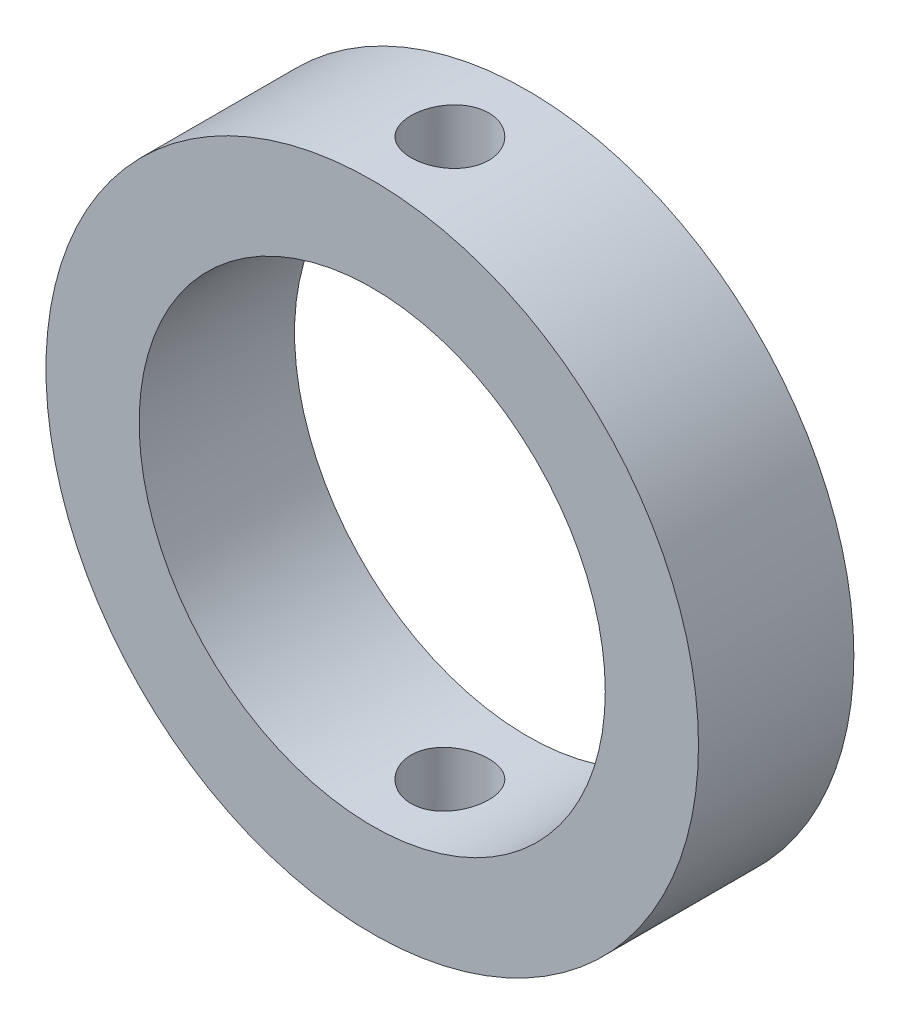
ISO-10303-21;
HEADER;
FILE_DESCRIPTION(('STEP AP214'),'2;1');
FILE_NAME('part.step','',(''),(''),'','','');
FILE_SCHEMA(('AUTOMOTIVE_DESIGN { 1 0 10303 214 1 1 1 1 }'));
ENDSEC;
DATA;
#1=APPLICATION_CONTEXT('core data for automotive mechanical design processes');
#2=APPLICATION_PROTOCOL_DEFINITION('international standard','automotive_design',2000,#1);
#3=PRODUCT_CONTEXT('',#1,'mechanical');
#4=PRODUCT('Part','Part','',(#3));
#5=PRODUCT_RELATED_PRODUCT_CATEGORY('part','',(#4));
#6=PRODUCT_DEFINITION_FORMATION('','',#4);
#7=PRODUCT_DEFINITION_CONTEXT('part definition',#1,'design');
#8=PRODUCT_DEFINITION('design','',#6,#7);
#9=PRODUCT_DEFINITION_SHAPE('','',#8);
#10=(LENGTH_UNIT() NAMED_UNIT(*) SI_UNIT(.MILLI.,.METRE.));
#11=(NAMED_UNIT(*) PLANE_ANGLE_UNIT() SI_UNIT($,.RADIAN.));
#12=(NAMED_UNIT(*) SI_UNIT($,.STERADIAN.) SOLID_ANGLE_UNIT());
#13=UNCERTAINTY_MEASURE_WITH_UNIT(LENGTH_MEASURE(1.E-05),#10,'distance_accuracy_value','');
#14=(GEOMETRIC_REPRESENTATION_CONTEXT(3) GLOBAL_UNCERTAINTY_ASSIGNED_CONTEXT((#13)) GLOBAL_UNIT_ASSIGNED_CONTEXT((#10,
#11,#12)) REPRESENTATION_CONTEXT('',''));
#15=CARTESIAN_POINT('',(0.,0.,0.));
#16=DIRECTION('',(0.,0.,1.));
#17=DIRECTION('',(1.,0.,0.));
#18=AXIS2_PLACEMENT_3D('',#15,#16,#17);
#19=CARTESIAN_POINT('',(0.,0.,20.));
#20=DIRECTION('',(0.,0.,1.));
#21=DIRECTION('',(1.,0.,0.));
#22=AXIS2_PLACEMENT_3D('',#19,#20,#21);
#23=PLANE('',#22);
#24=CARTESIAN_POINT('',(0.,0.,20.));
#25=DIRECTION('',(0.,0.,1.));
#26=DIRECTION('',(1.,0.,0.));
#27=AXIS2_PLACEMENT_3D('',#24,#25,#26);
#28=CIRCLE('',#27,42.);
#29=CARTESIAN_POINT('',(42.,0.,20.));
#30=VERTEX_POINT('',#29);
#31=EDGE_CURVE('E10',#30,#30,#28,.T.);
#32=ORIENTED_EDGE('',*,*,#31,.T.);
#33=EDGE_LOOP('',(#32));
#34=FACE_BOUND('',#33,.T.);
#35=CARTESIAN_POINT('',(0.,0.,20.));
#36=DIRECTION('',(0.,0.,1.));
#37=DIRECTION('',(1.,0.,0.));
#38=AXIS2_PLACEMENT_3D('',#35,#36,#37);
#39=CIRCLE('',#38,30.);
#40=CARTESIAN_POINT('',(30.,0.,20.));
#41=VERTEX_POINT('',#40);
#42=EDGE_CURVE('E53',#41,#41,#39,.T.);
#43=ORIENTED_EDGE('',*,*,#42,.F.);
#44=EDGE_LOOP('',(#43));
#45=FACE_BOUND('',#44,.T.);
#46=ADVANCED_FACE('F34',(#34,#45),#23,.T.);
#47=CARTESIAN_POINT('',(0.,0.,0.));
#48=DIRECTION('',(0.,0.,1.));
#49=DIRECTION('',(1.,0.,0.));
#50=AXIS2_PLACEMENT_3D('',#47,#48,#49);
#51=PLANE('',#50);
#52=CARTESIAN_POINT('',(0.,0.,0.));
#53=DIRECTION('',(0.,0.,1.));
#54=DIRECTION('',(1.,0.,0.));
#55=AXIS2_PLACEMENT_3D('',#52,#53,#54);
#56=CIRCLE('',#55,42.);
#57=CARTESIAN_POINT('',(42.,0.,0.));
#58=VERTEX_POINT('',#57);
#59=EDGE_CURVE('E48',#58,#58,#56,.T.);
#60=ORIENTED_EDGE('',*,*,#59,.F.);
#61=EDGE_LOOP('',(#60));
#62=FACE_BOUND('',#61,.T.);
#63=CARTESIAN_POINT('',(0.,0.,0.));
#64=DIRECTION('',(0.,0.,1.));
#65=DIRECTION('',(1.,0.,0.));
#66=AXIS2_PLACEMENT_3D('',#63,#64,#65);
#67=CIRCLE('',#66,30.);
#68=CARTESIAN_POINT('',(30.,0.,0.));
#69=VERTEX_POINT('',#68);
#70=EDGE_CURVE('E56',#69,#69,#67,.T.);
#71=ORIENTED_EDGE('',*,*,#70,.T.);
#72=EDGE_LOOP('',(#71));
#73=FACE_BOUND('',#72,.T.);
#74=ADVANCED_FACE('F92',(#62,#73),#51,.F.);
#75=CARTESIAN_POINT('',(0.,0.,20.));
#76=DIRECTION('',(0.,0.,-1.));
#77=DIRECTION('',(-1.,0.,0.));
#78=AXIS2_PLACEMENT_3D('',#75,#76,#77);
#79=CYLINDRICAL_SURFACE('',#78,42.);
#80=CARTESIAN_POINT('',(0.,-42.,15.));
#81=CARTESIAN_POINT('',(0.139944354363099,-42.0000004949897,15.0000015452399));
#82=CARTESIAN_POINT('',(0.279865797325127,-41.9992991699703,14.9941225446518));
#83=CARTESIAN_POINT('',(0.558753434111668,-41.9965145220194,14.9706513003711));
#84=CARTESIAN_POINT('',(0.697719400729112,-41.9944308811329,14.9530563618188));
#85=CARTESIAN_POINT('',(0.973761915633928,-41.9889374143182,14.9062615772954));
#86=CARTESIAN_POINT('',(1.11083694957687,-41.9855265828772,14.8770529321215));
#87=CARTESIAN_POINT('',(1.38206907083619,-41.9774737183032,14.80723431968));
#88=CARTESIAN_POINT('',(1.51622507016875,-41.9728312343342,14.7666201772079));
#89=CARTESIAN_POINT('',(1.78048081360988,-41.962451753986,14.6743400671554));
#90=CARTESIAN_POINT('',(1.9105845903052,-41.9567158889949,14.6226855171163));
#91=CARTESIAN_POINT('',(2.16601515302297,-41.9443051687777,14.5086525302541));
#92=CARTESIAN_POINT('',(2.29134015893693,-41.937629967906,14.4462701440433));
#93=CARTESIAN_POINT('',(2.53622022614491,-41.9235330381796,14.3112786416746));
#94=CARTESIAN_POINT('',(2.65577844608322,-41.9161117250251,14.2386752112937));
#95=CARTESIAN_POINT('',(2.88841356214349,-41.9007239047004,14.0837003497285));
#96=CARTESIAN_POINT('',(3.00148803694331,-41.8927571962604,14.0013253041732));
#97=CARTESIAN_POINT('',(3.22077543593456,-41.8764700742516,13.8270485756793));
#98=CARTESIAN_POINT('',(3.3269582781267,-41.8681483426035,13.7351091627358));
#99=CARTESIAN_POINT('',(3.53125018516053,-41.851413150985,13.5425949173204));
#100=CARTESIAN_POINT('',(3.62935624993001,-41.8429996582328,13.4420169041813));
#101=CARTESIAN_POINT('',(3.81673518406047,-41.826324006012,13.2329903886046));
#102=CARTESIAN_POINT('',(3.9060108539167,-41.8180617992459,13.1245444004743));
#103=CARTESIAN_POINT('',(4.07516833977939,-41.8019165473339,12.9004683531242));
#104=CARTESIAN_POINT('',(4.15504667787217,-41.7940336432003,12.7848356581796));
#105=CARTESIAN_POINT('',(4.30500604364952,-41.7788537546125,12.5469096549299));
#106=CARTESIAN_POINT('',(4.37506022402714,-41.7715583980731,12.4245993167788));
#107=CARTESIAN_POINT('',(4.50463596718224,-41.7577837252467,12.1744218352863));
#108=CARTESIAN_POINT('',(4.56415361355771,-41.7513047126495,12.0465526476396));
#109=CARTESIAN_POINT('',(4.67216953766343,-41.7393554520715,11.7862445891333));
#110=CARTESIAN_POINT('',(4.72067218018275,-41.7338848046798,11.6538075523699));
#111=CARTESIAN_POINT('',(4.80634517960319,-41.7241042689141,11.3852614255014));
#112=CARTESIAN_POINT('',(4.84351137196641,-41.7197948071787,11.2491510058872));
#113=CARTESIAN_POINT('',(4.9372027281611,-41.7088503497402,10.8381684238465));
#114=CARTESIAN_POINT('',(4.97655648665055,-41.7041265006846,10.5591076026795));
#115=CARTESIAN_POINT('',(5.00788746470176,-41.7003750514059,9.99845761684209));
#116=CARTESIAN_POINT('',(4.99986641846453,-41.7013472426735,9.71686854509753));
#117=CARTESIAN_POINT('',(4.93691925345352,-41.7088457238025,9.16050369866586));
#118=CARTESIAN_POINT('',(4.88223571489001,-41.7153432887861,8.88570023687901));
#119=CARTESIAN_POINT('',(4.7278774375398,-41.7331182028228,8.3492093128223));
#120=CARTESIAN_POINT('',(4.62820186490261,-41.7443956404624,8.08752209373948));
#121=CARTESIAN_POINT('',(4.38643076186473,-41.7704916451496,7.58392167127384));
#122=CARTESIAN_POINT('',(4.24422922065743,-41.7853190430717,7.34205983217267));
#123=CARTESIAN_POINT('',(3.9215174935268,-41.8168375119846,6.88554200064296));
#124=CARTESIAN_POINT('',(3.74100571770876,-41.8335286603085,6.67088713790881));
#125=CARTESIAN_POINT('',(3.3454504344872,-41.8670217534863,6.27346673923702));
#126=CARTESIAN_POINT('',(3.1301976709083,-41.8838237373492,6.09090941518856));
#127=CARTESIAN_POINT('',(2.67199262987613,-41.9155473088986,5.76448576238507));
#128=CARTESIAN_POINT('',(2.42904029824012,-41.9304688929067,5.62061950931497));
#129=CARTESIAN_POINT('',(1.92217630446759,-41.9567584664325,5.37566380920818));
#130=CARTESIAN_POINT('',(1.65825859360907,-41.9681254257016,5.27458676090949));
#131=CARTESIAN_POINT('',(1.11703163035212,-41.9860154143335,5.11824070116633));
#132=CARTESIAN_POINT('',(0.839722946824823,-41.9925386492733,5.06296974561025));
#133=CARTESIAN_POINT('',(0.28138684602624,-41.9999795644235,5.00007318869848));
#134=CARTESIAN_POINT('',(0.000392185625471963,-42.0009310040607,4.99216063700724));
#135=CARTESIAN_POINT('',(-0.558919147792539,-41.9972121160866,5.02344916465674));
#136=CARTESIAN_POINT('',(-0.837235872323135,-41.9925418968335,5.06264933589325));
#137=CARTESIAN_POINT('',(-1.38244901314671,-41.9781255971043,5.18681223449698));
#138=CARTESIAN_POINT('',(-1.64937687716562,-41.968394624988,5.2716387746839));
#139=CARTESIAN_POINT('',(-2.16521740415563,-41.9449468082368,5.48450540270109));
#140=CARTESIAN_POINT('',(-2.4141295073942,-41.9312298398271,5.61254683247754));
#141=CARTESIAN_POINT('',(-2.88815848479386,-41.9012563694678,5.90890707916483));
#142=CARTESIAN_POINT('',(-3.11315809355009,-41.8849882412343,6.07741226574401));
#143=CARTESIAN_POINT('',(-3.53178356378925,-41.8517704159837,6.44965321220897));
#144=CARTESIAN_POINT('',(-3.72540829907094,-41.8348206945282,6.65339023619934));
#145=CARTESIAN_POINT('',(-4.07680060683295,-41.8020464031843,7.09156873458985));
#146=CARTESIAN_POINT('',(-4.23437844554106,-41.7862280751084,7.32616288339302));
#147=CARTESIAN_POINT('',(-4.50789342465239,-41.7576088168648,7.81866641430672));
#148=CARTESIAN_POINT('',(-4.6238313335656,-41.7448078310103,8.07657536600735));
#149=CARTESIAN_POINT('',(-4.81047068023071,-41.7237128540432,8.60771268301076));
#150=CARTESIAN_POINT('',(-4.88128060298597,-41.7154080616438,8.88090257922418));
#151=CARTESIAN_POINT('',(-4.97598481647499,-41.7042198361246,9.43555399666805));
#152=CARTESIAN_POINT('',(-4.99988107123533,-41.7013361760512,9.7170151711232));
#153=CARTESIAN_POINT('',(-5.00005866509167,-41.7013104015817,10.1380479024937));
#154=CARTESIAN_POINT('',(-4.99423500434761,-41.7020110064232,10.2778335938329));
#155=CARTESIAN_POINT('',(-4.97090704765275,-41.704798930546,10.5563989336));
#156=CARTESIAN_POINT('',(-4.95340709880603,-41.7068857337418,10.6951789370168));
#157=CARTESIAN_POINT('',(-4.90684213506944,-41.7123895278416,10.9707997712821));
#158=CARTESIAN_POINT('',(-4.87777290545236,-41.7158070035042,11.1076398765837));
#159=CARTESIAN_POINT('',(-4.80829883981558,-41.7238718917759,11.3783235484503));
#160=CARTESIAN_POINT('',(-4.76789813257033,-41.7285188563693,11.5121681873089));
#161=CARTESIAN_POINT('',(-4.67604761387999,-41.7389112510551,11.7759754741421));
#162=CARTESIAN_POINT('',(-4.6245970901974,-41.7446567519531,11.9059378712638));
#163=CARTESIAN_POINT('',(-4.51104051642293,-41.7570805085636,12.1610174423825));
#164=CARTESIAN_POINT('',(-4.44893834079982,-41.7637584249525,12.2861363579518));
#165=CARTESIAN_POINT('',(-4.3144835331244,-41.7778625622833,12.5307544506839));
#166=CARTESIAN_POINT('',(-4.24212717967629,-41.785289054611,12.650251566547));
#167=CARTESIAN_POINT('',(-4.08771943242425,-41.8006766060372,12.8827092521508));
#168=CARTESIAN_POINT('',(-4.00567153563045,-41.8086374718722,12.9956721578527));
#169=CARTESIAN_POINT('',(-3.83187575083174,-41.8249254846849,13.2150325792318));
#170=CARTESIAN_POINT('',(-3.74006898381683,-41.8332546546657,13.321383301431));
#171=CARTESIAN_POINT('',(-3.54787347689337,-41.8499927410577,13.5259442569554));
#172=CARTESIAN_POINT('',(-3.44748786570324,-41.8584016274099,13.6241574325369));
#173=CARTESIAN_POINT('',(-3.23874304684157,-41.8750702711621,13.811857373199));
#174=CARTESIAN_POINT('',(-3.13037905257608,-41.8833299352752,13.9013388236282));
#175=CARTESIAN_POINT('',(-2.90652865750312,-41.8994591404318,14.0708469056788));
#176=CARTESIAN_POINT('',(-2.7910449022692,-41.9073288244473,14.1508770173997));
#177=CARTESIAN_POINT('',(-2.55326788843276,-41.922488788253,14.3012423074693));
#178=CARTESIAN_POINT('',(-2.43095016804525,-41.9297767253409,14.3715390490336));
#179=CARTESIAN_POINT('',(-2.18082347325339,-41.9435297784857,14.50154068032));
#180=CARTESIAN_POINT('',(-2.05301653397796,-41.9499951960292,14.5612494541363));
#181=CARTESIAN_POINT('',(-1.79287517006296,-41.9619176479207,14.6696289990681));
#182=CARTESIAN_POINT('',(-1.66054441892524,-41.9673754784491,14.71830849233));
#183=CARTESIAN_POINT('',(-1.39225024202624,-41.9771326489675,14.8043195459756));
#184=CARTESIAN_POINT('',(-1.25628769073185,-41.9814322651181,14.8416538117477));
#185=CARTESIAN_POINT('',(-0.935703835675645,-41.9899751085719,14.9152607724878));
#186=CARTESIAN_POINT('',(-0.750011252154209,-41.9937189304148,14.9470058413391));
#187=CARTESIAN_POINT('',(-0.376198641026752,-41.9987310355075,14.9893743484741));
#188=CARTESIAN_POINT('',(-0.188078629117603,-41.9999993347571,14.9999979232702));
#189=CARTESIAN_POINT('',(0.,-42.,15.));
#190=B_SPLINE_CURVE_WITH_KNOTS('',3,(#80,#81,#82,#83,#84,#85,#86,#87,#88,#89,#90,#91,#92,#93,
#94,#95,#96,#97,#98,#99,#100,#101,#102,#103,#104,#105,#106,#107,#108,#109,#110,#111,#112,#113,
#114,#115,#116,#117,#118,#119,#120,#121,#122,#123,#124,#125,#126,#127,#128,#129,#130,#131,#132,
#133,#134,#135,#136,#137,#138,#139,#140,#141,#142,#143,#144,#145,#146,#147,#148,#149,#150,#151,
#152,#153,#154,#155,#156,#157,#158,#159,#160,#161,#162,#163,#164,#165,#166,#167,#168,#169,#170,
#171,#172,#173,#174,#175,#176,#177,#178,#179,#180,#181,#182,#183,#184,#185,#186,#187,#188,#189),
.UNSPECIFIED.,.T.,.F.,(4,2,2,2,2,2,2,2,2,2,2,2,2,2,2,2,2,2,2,2,2,2,2,2,2,2,2,2,2,2,2,2,2,2,2,2,
2,2,2,2,2,2,2,2,2,2,2,2,2,2,2,2,2,2,4),(0.,0.419668506634463,0.839433577330225,1.25951729373492,
1.67975499088286,2.09956018006342,2.51952025012533,2.93924762060252,3.35913072877321,
3.78073799142715,4.20250115765236,4.62413013298358,5.04591466381166,5.46883027001937,
5.8919027442964,6.31480727884302,6.73786698424718,7.57905446884665,8.42021116114737,
9.25702146156424,10.0938472714672,10.932776801606,11.7717411545678,12.6159616193258,
13.46018373548,14.3046503089939,15.1490810396479,15.9883900397533,16.8276828623214,
17.6644843244192,18.5013117739918,19.3420700506627,20.182858499674,21.0279755425109,
21.8730769869958,22.7161391174264,23.559165952562,23.9784839617134,24.3976459450241,
24.8169607704128,25.2361230109081,25.6553122774369,26.0743493887252,26.4935389662041,
26.9125777464684,27.3343061152839,27.7558813301424,28.1777115610534,28.5993859813699,
29.0226807827395,29.4458199797904,29.8686233738846,30.291325866822,30.8553442434179,
31.4193589746364),.UNSPECIFIED.);
#191=CARTESIAN_POINT('',(0.,-42.,15.));
#192=VERTEX_POINT('',#191);
#193=EDGE_CURVE('E81',#192,#192,#190,.T.);
#194=ORIENTED_EDGE('',*,*,#193,.T.);
#195=EDGE_LOOP('',(#194));
#196=FACE_BOUND('',#195,.T.);
#197=CARTESIAN_POINT('',(0.,42.,15.));
#198=CARTESIAN_POINT('',(-0.139944354363099,42.0000004949897,15.0000015452399));
#199=CARTESIAN_POINT('',(-0.279865797325128,41.9992991699703,14.9941225446518));
#200=CARTESIAN_POINT('',(-0.55875343411167,41.9965145220195,14.9706513003711));
#201=CARTESIAN_POINT('',(-0.697719400729113,41.9944308811329,14.9530563618188));
#202=CARTESIAN_POINT('',(-0.973761915633929,41.9889374143182,14.9062615772954));
#203=CARTESIAN_POINT('',(-1.11083694957687,41.9855265828772,14.8770529321215));
#204=CARTESIAN_POINT('',(-1.38206907083619,41.9774737183032,14.80723431968));
#205=CARTESIAN_POINT('',(-1.51622507016875,41.9728312343342,14.7666201772079));
#206=CARTESIAN_POINT('',(-1.78048081360988,41.962451753986,14.6743400671554));
#207=CARTESIAN_POINT('',(-1.9105845903052,41.9567158889949,14.6226855171162));
#208=CARTESIAN_POINT('',(-2.16601515302298,41.9443051687777,14.5086525302541));
#209=CARTESIAN_POINT('',(-2.29134015893693,41.937629967906,14.4462701440433));
#210=CARTESIAN_POINT('',(-2.53622022614491,41.9235330381796,14.3112786416746));
#211=CARTESIAN_POINT('',(-2.65577844608322,41.9161117250251,14.2386752112937));
#212=CARTESIAN_POINT('',(-2.88841356214349,41.9007239047004,14.0837003497285));
#213=CARTESIAN_POINT('',(-3.00148803694331,41.8927571962604,14.0013253041732));
#214=CARTESIAN_POINT('',(-3.22077543593457,41.8764700742516,13.8270485756793));
#215=CARTESIAN_POINT('',(-3.3269582781267,41.8681483426035,13.7351091627358));
#216=CARTESIAN_POINT('',(-3.53125018516053,41.851413150985,13.5425949173203));
#217=CARTESIAN_POINT('',(-3.62935624993001,41.8429996582328,13.4420169041813));
#218=CARTESIAN_POINT('',(-3.81673518406047,41.826324006012,13.2329903886046));
#219=CARTESIAN_POINT('',(-3.9060108539167,41.8180617992459,13.1245444004743));
#220=CARTESIAN_POINT('',(-4.07516833977939,41.8019165473339,12.9004683531242));
#221=CARTESIAN_POINT('',(-4.15504667787217,41.7940336432003,12.7848356581795));
#222=CARTESIAN_POINT('',(-4.30500604364953,41.7788537546125,12.5469096549299));
#223=CARTESIAN_POINT('',(-4.37506022402714,41.7715583980731,12.4245993167788));
#224=CARTESIAN_POINT('',(-4.50463596718224,41.7577837252467,12.1744218352863));
#225=CARTESIAN_POINT('',(-4.56415361355771,41.7513047126495,12.0465526476396));
#226=CARTESIAN_POINT('',(-4.67216953766343,41.7393554520715,11.7862445891333));
#227=CARTESIAN_POINT('',(-4.72067218018275,41.7338848046798,11.6538075523699));
#228=CARTESIAN_POINT('',(-4.80634517960319,41.7241042689141,11.3852614255014));
#229=CARTESIAN_POINT('',(-4.84351137196641,41.7197948071787,11.2491510058872));
#230=CARTESIAN_POINT('',(-4.9372027281611,41.7088503497402,10.8381684238465));
#231=CARTESIAN_POINT('',(-4.97655648665055,41.7041265006846,10.5591076026795));
#232=CARTESIAN_POINT('',(-5.00788746470176,41.7003750514059,9.99845761684209));
#233=CARTESIAN_POINT('',(-4.99986641846453,41.7013472426735,9.71686854509753));
#234=CARTESIAN_POINT('',(-4.93691925345352,41.7088457238025,9.16050369866586));
#235=CARTESIAN_POINT('',(-4.88223571489001,41.7153432887861,8.885700236879));
#236=CARTESIAN_POINT('',(-4.7278774375398,41.7331182028228,8.3492093128223));
#237=CARTESIAN_POINT('',(-4.62820186490261,41.7443956404624,8.08752209373947));
#238=CARTESIAN_POINT('',(-4.38643076186473,41.7704916451496,7.58392167127384));
#239=CARTESIAN_POINT('',(-4.24422922065743,41.7853190430717,7.34205983217266));
#240=CARTESIAN_POINT('',(-3.92151749352679,41.8168375119846,6.88554200064296));
#241=CARTESIAN_POINT('',(-3.74100571770876,41.8335286603085,6.67088713790881));
#242=CARTESIAN_POINT('',(-3.3454504344872,41.8670217534863,6.27346673923702));
#243=CARTESIAN_POINT('',(-3.13019767090829,41.8838237373492,6.09090941518855));
#244=CARTESIAN_POINT('',(-2.67199262987613,41.9155473088986,5.76448576238507));
#245=CARTESIAN_POINT('',(-2.42904029824012,41.9304688929067,5.62061950931497));
#246=CARTESIAN_POINT('',(-1.92217630446759,41.9567584664325,5.37566380920818));
#247=CARTESIAN_POINT('',(-1.65825859360907,41.9681254257016,5.27458676090949));
#248=CARTESIAN_POINT('',(-1.11703163035212,41.9860154143335,5.11824070116633));
#249=CARTESIAN_POINT('',(-0.839722946824822,41.9925386492733,5.06296974561025));
#250=CARTESIAN_POINT('',(-0.281386846026238,41.9999795644235,5.00007318869848));
#251=CARTESIAN_POINT('',(-0.000392185625470065,42.0009310040607,4.99216063700724));
#252=CARTESIAN_POINT('',(0.558919147792541,41.9972121160866,5.02344916465674));
#253=CARTESIAN_POINT('',(0.837235872323136,41.9925418968335,5.06264933589325));
#254=CARTESIAN_POINT('',(1.38244901314671,41.9781255971043,5.18681223449698));
#255=CARTESIAN_POINT('',(1.64937687716562,41.968394624988,5.2716387746839));
#256=CARTESIAN_POINT('',(2.16521740415563,41.9449468082368,5.4845054027011));
#257=CARTESIAN_POINT('',(2.4141295073942,41.9312298398271,5.61254683247754));
#258=CARTESIAN_POINT('',(2.88815848479386,41.9012563694678,5.90890707916483));
#259=CARTESIAN_POINT('',(3.1131580935501,41.8849882412343,6.07741226574401));
#260=CARTESIAN_POINT('',(3.53178356378925,41.8517704159837,6.44965321220897));
#261=CARTESIAN_POINT('',(3.72540829907094,41.8348206945282,6.65339023619934));
#262=CARTESIAN_POINT('',(4.07680060683295,41.8020464031843,7.09156873458986));
#263=CARTESIAN_POINT('',(4.23437844554106,41.7862280751084,7.32616288339302));
#264=CARTESIAN_POINT('',(4.50789342465239,41.7576088168648,7.81866641430672));
#265=CARTESIAN_POINT('',(4.62383133356561,41.7448078310103,8.07657536600735));
#266=CARTESIAN_POINT('',(4.81047068023071,41.7237128540432,8.60771268301076));
#267=CARTESIAN_POINT('',(4.88128060298597,41.7154080616438,8.88090257922418));
#268=CARTESIAN_POINT('',(4.97598481647499,41.7042198361246,9.43555399666805));
#269=CARTESIAN_POINT('',(4.99988107123533,41.7013361760512,9.7170151711232));
#270=CARTESIAN_POINT('',(5.00005866509167,41.7013104015817,10.1380479024937));
#271=CARTESIAN_POINT('',(4.99423500434761,41.7020110064232,10.2778335938329));
#272=CARTESIAN_POINT('',(4.97090704765275,41.704798930546,10.5563989336));
#273=CARTESIAN_POINT('',(4.95340709880603,41.7068857337418,10.6951789370168));
#274=CARTESIAN_POINT('',(4.90684213506944,41.7123895278416,10.9707997712821));
#275=CARTESIAN_POINT('',(4.87777290545236,41.7158070035042,11.1076398765837));
#276=CARTESIAN_POINT('',(4.80829883981557,41.7238718917759,11.3783235484503));
#277=CARTESIAN_POINT('',(4.76789813257033,41.7285188563693,11.5121681873089));
#278=CARTESIAN_POINT('',(4.67604761387999,41.7389112510551,11.7759754741421));
#279=CARTESIAN_POINT('',(4.6245970901974,41.7446567519531,11.9059378712638));
#280=CARTESIAN_POINT('',(4.51104051642293,41.7570805085636,12.1610174423825));
#281=CARTESIAN_POINT('',(4.44893834079982,41.7637584249525,12.2861363579518));
#282=CARTESIAN_POINT('',(4.3144835331244,41.7778625622833,12.5307544506839));
#283=CARTESIAN_POINT('',(4.24212717967629,41.785289054611,12.650251566547));
#284=CARTESIAN_POINT('',(4.08771943242425,41.8006766060372,12.8827092521508));
#285=CARTESIAN_POINT('',(4.00567153563045,41.8086374718722,12.9956721578527));
#286=CARTESIAN_POINT('',(3.83187575083174,41.8249254846849,13.2150325792318));
#287=CARTESIAN_POINT('',(3.74006898381683,41.8332546546657,13.321383301431));
#288=CARTESIAN_POINT('',(3.54787347689338,41.8499927410577,13.5259442569554));
#289=CARTESIAN_POINT('',(3.44748786570324,41.8584016274099,13.6241574325369));
#290=CARTESIAN_POINT('',(3.23874304684157,41.8750702711621,13.811857373199));
#291=CARTESIAN_POINT('',(3.13037905257608,41.8833299352752,13.9013388236282));
#292=CARTESIAN_POINT('',(2.90652865750312,41.8994591404318,14.0708469056788));
#293=CARTESIAN_POINT('',(2.7910449022692,41.9073288244473,14.1508770173997));
#294=CARTESIAN_POINT('',(2.55326788843276,41.922488788253,14.3012423074693));
#295=CARTESIAN_POINT('',(2.43095016804524,41.9297767253409,14.3715390490336));
#296=CARTESIAN_POINT('',(2.18082347325339,41.9435297784857,14.50154068032));
#297=CARTESIAN_POINT('',(2.05301653397796,41.9499951960292,14.5612494541363));
#298=CARTESIAN_POINT('',(1.79287517006295,41.9619176479207,14.6696289990681));
#299=CARTESIAN_POINT('',(1.66054441892524,41.9673754784491,14.71830849233));
#300=CARTESIAN_POINT('',(1.39225024202624,41.9771326489675,14.8043195459756));
#301=CARTESIAN_POINT('',(1.25628769073185,41.9814322651181,14.8416538117477));
#302=CARTESIAN_POINT('',(0.935703835675645,41.9899751085719,14.9152607724878));
#303=CARTESIAN_POINT('',(0.750011252154209,41.9937189304148,14.9470058413391));
#304=CARTESIAN_POINT('',(0.376198641026752,41.9987310355075,14.9893743484741));
#305=CARTESIAN_POINT('',(0.188078629117603,41.9999993347571,14.9999979232702));
#306=CARTESIAN_POINT('',(0.,42.,15.));
#307=B_SPLINE_CURVE_WITH_KNOTS('',3,(#197,#198,#199,#200,#201,#202,#203,#204,#205,#206,#207,
#208,#209,#210,#211,#212,#213,#214,#215,#216,#217,#218,#219,#220,#221,#222,#223,#224,#225,#226,
#227,#228,#229,#230,#231,#232,#233,#234,#235,#236,#237,#238,#239,#240,#241,#242,#243,#244,#245,
#246,#247,#248,#249,#250,#251,#252,#253,#254,#255,#256,#257,#258,#259,#260,#261,#262,#263,#264,
#265,#266,#267,#268,#269,#270,#271,#272,#273,#274,#275,#276,#277,#278,#279,#280,#281,#282,#283,
#284,#285,#286,#287,#288,#289,#290,#291,#292,#293,#294,#295,#296,#297,#298,#299,#300,#301,#302,
#303,#304,#305,#306),.UNSPECIFIED.,.T.,.F.,(4,2,2,2,2,2,2,2,2,2,2,2,2,2,2,2,2,2,2,2,2,2,2,2,2,2,
2,2,2,2,2,2,2,2,2,2,2,2,2,2,2,2,2,2,2,2,2,2,2,2,2,2,2,2,4),(0.,0.419668506634464,
0.839433577330226,1.25951729373493,1.67975499088286,2.09956018006342,2.51952025012533,
2.93924762060252,3.35913072877321,3.78073799142715,4.20250115765237,4.62413013298359,
5.04591466381167,5.46883027001938,5.8919027442964,6.31480727884302,6.73786698424718,
7.57905446884665,8.42021116114737,9.25702146156424,10.0938472714672,10.932776801606,
11.7717411545678,12.6159616193258,13.46018373548,14.3046503089939,15.1490810396479,
15.9883900397533,16.8276828623214,17.6644843244192,18.5013117739918,19.3420700506628,
20.182858499674,21.0279755425109,21.8730769869959,22.7161391174264,23.559165952562,
23.9784839617134,24.3976459450241,24.8169607704128,25.2361230109081,25.6553122774369,
26.0743493887252,26.4935389662041,26.9125777464684,27.3343061152839,27.7558813301424,
28.1777115610533,28.5993859813699,29.0226807827395,29.4458199797904,29.8686233738846,
30.291325866822,30.8553442434179,31.4193589746364),.UNSPECIFIED.);
#308=CARTESIAN_POINT('',(0.,42.,15.));
#309=VERTEX_POINT('',#308);
#310=EDGE_CURVE('E76',#309,#309,#307,.T.);
#311=ORIENTED_EDGE('',*,*,#310,.T.);
#312=EDGE_LOOP('',(#311));
#313=FACE_BOUND('',#312,.T.);
#314=ORIENTED_EDGE('',*,*,#31,.F.);
#315=EDGE_LOOP('',(#314));
#316=FACE_BOUND('',#315,.T.);
#317=ORIENTED_EDGE('',*,*,#59,.T.);
#318=EDGE_LOOP('',(#317));
#319=FACE_BOUND('',#318,.T.);
#320=ADVANCED_FACE('F36',(#196,#313,#316,#319),#79,.T.);
#321=CARTESIAN_POINT('',(0.,0.,20.));
#322=DIRECTION('',(0.,0.,-1.));
#323=DIRECTION('',(-1.,0.,0.));
#324=AXIS2_PLACEMENT_3D('',#321,#322,#323);
#325=CYLINDRICAL_SURFACE('',#324,30.);
#326=CARTESIAN_POINT('',(0.,-30.,15.));
#327=CARTESIAN_POINT('',(0.139438730306518,-30.0000009341092,15.000002148603));
#328=CARTESIAN_POINT('',(0.278848374995361,-29.9990260400444,14.9941652443515));
#329=CARTESIAN_POINT('',(0.556708896140973,-29.9951557115239,14.9708658164974));
#330=CARTESIAN_POINT('',(0.695159577308832,-29.9922598968632,14.9534009913958));
#331=CARTESIAN_POINT('',(0.970150520344155,-29.9846251699259,14.9069611871019));
#332=CARTESIAN_POINT('',(1.10668952072418,-29.979885095025,14.8779789470685));
#333=CARTESIAN_POINT('',(1.37685247096437,-29.9686930297133,14.8087139445942));
#334=CARTESIAN_POINT('',(1.51047533178691,-29.9622404112013,14.7684270356836));
#335=CARTESIAN_POINT('',(1.77365528085701,-29.9478128865369,14.6769149986391));
#336=CARTESIAN_POINT('',(1.90321704710935,-29.9398398129292,14.6257030293222));
#337=CARTESIAN_POINT('',(2.15759207174615,-29.9225843720657,14.512668231626));
#338=CARTESIAN_POINT('',(2.28240355940392,-29.9133015225275,14.4508414928787));
#339=CARTESIAN_POINT('',(2.52631223217171,-29.8936901460056,14.3170688876175));
#340=CARTESIAN_POINT('',(2.64541222152925,-29.8833621400859,14.2451280566014));
#341=CARTESIAN_POINT('',(2.87720075943645,-29.8619368035706,14.0915826775771));
#342=CARTESIAN_POINT('',(2.98988690101178,-29.8508391875783,14.0099745365835));
#343=CARTESIAN_POINT('',(3.20893550320274,-29.8280901061561,13.8369740483396));
#344=CARTESIAN_POINT('',(3.3152386019937,-29.8164348485225,13.7455070296461));
#345=CARTESIAN_POINT('',(3.51981905081324,-29.792977049997,13.5539441062719));
#346=CARTESIAN_POINT('',(3.6180934149484,-29.7811744561748,13.4538450195095));
#347=CARTESIAN_POINT('',(3.80586900468401,-29.757760553176,13.2457655657288));
#348=CARTESIAN_POINT('',(3.89537288715651,-29.7461491869625,13.137787602886));
#349=CARTESIAN_POINT('',(4.06505128766863,-29.7234367117224,12.9146207574097));
#350=CARTESIAN_POINT('',(4.14522235269035,-29.7123357924676,12.7994292299429));
#351=CARTESIAN_POINT('',(4.29606801839333,-29.6909016370194,12.5619714746938));
#352=CARTESIAN_POINT('',(4.36668480543058,-29.6805732300208,12.4396680682227));
#353=CARTESIAN_POINT('',(4.49737903615683,-29.6610510502017,12.1894109133508));
#354=CARTESIAN_POINT('',(4.55745254274493,-29.6518577016161,12.0614550764348));
#355=CARTESIAN_POINT('',(4.66655756396113,-29.6348831234285,11.800880688985));
#356=CARTESIAN_POINT('',(4.7155937427807,-29.6271012976113,11.6682641354876));
#357=CARTESIAN_POINT('',(4.80229722760728,-29.6131700678879,11.399267690265));
#358=CARTESIAN_POINT('',(4.83996038282925,-29.6070212600786,11.2628864443209));
#359=CARTESIAN_POINT('',(4.93477467758659,-29.5914227981395,10.8521985241443));
#360=CARTESIAN_POINT('',(4.97488357358493,-29.5846386003063,10.5736311346302));
#361=CARTESIAN_POINT('',(5.00784793424048,-29.5790755483693,10.0137968416156));
#362=CARTESIAN_POINT('',(5.00070674304215,-29.5802961277241,9.73253013056755));
#363=CARTESIAN_POINT('',(4.93978637434362,-29.590529429811,9.17815552142719));
#364=CARTESIAN_POINT('',(4.88648873937525,-29.5994616948564,8.90499340626046));
#365=CARTESIAN_POINT('',(4.73550730524632,-29.6239896757343,8.37155435088745));
#366=CARTESIAN_POINT('',(4.63782198375658,-29.6395856201047,8.11127785294846));
#367=CARTESIAN_POINT('',(4.40035421574883,-29.6757696483376,7.60954316628106));
#368=CARTESIAN_POINT('',(4.2603717536546,-29.6963813586745,7.36818140582109));
#369=CARTESIAN_POINT('',(3.94242410922567,-29.7402583517709,6.91219098092209));
#370=CARTESIAN_POINT('',(3.76445586128013,-29.7635238486315,6.69756447634457));
#371=CARTESIAN_POINT('',(3.37296440409906,-29.8104405621052,6.29834788785885));
#372=CARTESIAN_POINT('',(3.15902792232791,-29.8340929858412,6.1141629788504));
#373=CARTESIAN_POINT('',(2.70307050338167,-29.8788520267263,5.78424445873864));
#374=CARTESIAN_POINT('',(2.46104938526711,-29.8999586274719,5.63851109538496));
#375=CARTESIAN_POINT('',(1.95541183087793,-29.9372778581815,5.38959554997958));
#376=CARTESIAN_POINT('',(1.6917774507324,-29.9534863682324,5.28644916239581));
#377=CARTESIAN_POINT('',(1.15059669160235,-29.9791500601698,5.12601156844981));
#378=CARTESIAN_POINT('',(0.873051478491171,-29.988605806999,5.06871652607124));
#379=CARTESIAN_POINT('',(0.315419802472562,-29.999622596864,5.00215728305927));
#380=CARTESIAN_POINT('',(0.0354014741699757,-30.0012750602153,4.99233685528186));
#381=CARTESIAN_POINT('',(-0.522279545647737,-29.9967494884638,5.01952268996313));
#382=CARTESIAN_POINT('',(-0.799942327386603,-29.9905717546544,5.05652715067646));
#383=CARTESIAN_POINT('',(-1.3433123514886,-29.971136538593,5.17584969428863));
#384=CARTESIAN_POINT('',(-1.60908173821583,-29.9579220953842,5.25789240039748));
#385=CARTESIAN_POINT('',(-2.12309376827574,-29.9258892897492,5.46466905278275));
#386=CARTESIAN_POINT('',(-2.37133542643381,-29.9070706126377,5.58940539642431));
#387=CARTESIAN_POINT('',(-2.84566138437113,-29.8656903236297,5.87930218769946));
#388=CARTESIAN_POINT('',(-3.07153052223238,-29.8430971086773,6.04481008114228));
#389=CARTESIAN_POINT('',(-3.49248715064582,-29.7967693569018,6.41107486197914));
#390=CARTESIAN_POINT('',(-3.68757240338597,-29.7730347372687,6.61183430971994));
#391=CARTESIAN_POINT('',(-4.04348563611056,-29.7268034705286,7.0453942240347));
#392=CARTESIAN_POINT('',(-4.20393781021313,-29.7043221945332,7.27850506055189));
#393=CARTESIAN_POINT('',(-4.48340433261341,-29.6634307237625,7.76870920865033));
#394=CARTESIAN_POINT('',(-4.60241999444133,-29.6450203999454,8.02580175968779));
#395=CARTESIAN_POINT('',(-4.79507773356378,-29.6144685973239,8.55556730727753));
#396=CARTESIAN_POINT('',(-4.86890685306042,-29.602301310812,8.82817090119132));
#397=CARTESIAN_POINT('',(-4.96966691993878,-29.5855561119601,9.38228554337533));
#398=CARTESIAN_POINT('',(-4.99660194454599,-29.580977539818,9.66379581508379));
#399=CARTESIAN_POINT('',(-5.0012321244509,-29.5801885462874,10.0844097834175));
#400=CARTESIAN_POINT('',(-4.99693975789018,-29.5809172344068,10.2235369220243));
#401=CARTESIAN_POINT('',(-4.97678436801742,-29.5843160283654,10.5009125844857));
#402=CARTESIAN_POINT('',(-4.96092569221814,-29.5869854047428,10.6391614187853));
#403=CARTESIAN_POINT('',(-4.91774640529921,-29.5941926651669,10.9138477892769));
#404=CARTESIAN_POINT('',(-4.89042170080803,-29.5987312164982,11.0502846606349));
#405=CARTESIAN_POINT('',(-4.82453301754958,-29.6095423170401,11.3202964548754));
#406=CARTESIAN_POINT('',(-4.7859730845885,-29.615814242021,11.4538723894262));
#407=CARTESIAN_POINT('',(-4.6979342864003,-29.6299071307843,11.7171686051217));
#408=CARTESIAN_POINT('',(-4.64846435664851,-29.6377268263817,11.846891943521));
#409=CARTESIAN_POINT('',(-4.53896986674982,-29.6546930297384,12.1016587264378));
#410=CARTESIAN_POINT('',(-4.47894908739059,-29.6638390620139,12.226703827951));
#411=CARTESIAN_POINT('',(-4.34874498523013,-29.6832065043881,12.4713614507995));
#412=CARTESIAN_POINT('',(-4.27855767862003,-29.6934283356131,12.5909718182554));
#413=CARTESIAN_POINT('',(-4.12855715704193,-29.7146554589665,12.8238615256318));
#414=CARTESIAN_POINT('',(-4.04874732556528,-29.7256604751555,12.9371430705211));
#415=CARTESIAN_POINT('',(-3.87899685367998,-29.7482907408856,13.1580086987021));
#416=CARTESIAN_POINT('',(-3.78894418512202,-29.7599219326499,13.2655060901041));
#417=CARTESIAN_POINT('',(-3.60017574898997,-29.783347263822,13.472513396479));
#418=CARTESIAN_POINT('',(-3.50146308651917,-29.7951413435574,13.5720261500963));
#419=CARTESIAN_POINT('',(-3.29596225179814,-29.8185735949796,13.7624819299774));
#420=CARTESIAN_POINT('',(-3.18916929766622,-29.8302116694714,13.8534198090311));
#421=CARTESIAN_POINT('',(-2.9683310868055,-29.8529952569281,14.0259957161049));
#422=CARTESIAN_POINT('',(-2.8542885214692,-29.8641409501131,14.1076371643346));
#423=CARTESIAN_POINT('',(-2.61883824287209,-29.8857116363867,14.2616450304106));
#424=CARTESIAN_POINT('',(-2.49738284629917,-29.896130775176,14.3339393989323));
#425=CARTESIAN_POINT('',(-2.24876507402075,-29.9158586577262,14.4679967471859));
#426=CARTESIAN_POINT('',(-2.1216048197654,-29.925167809621,14.5297636014166));
#427=CARTESIAN_POINT('',(-1.86251821435404,-29.9424090895346,14.6423007062681));
#428=CARTESIAN_POINT('',(-1.73059524615479,-29.950342172599,14.6930785897747));
#429=CARTESIAN_POINT('',(-1.46288984328885,-29.9646113279921,14.7832948188954));
#430=CARTESIAN_POINT('',(-1.32710824358209,-29.9709477429356,14.8227355974939));
#431=CARTESIAN_POINT('',(-0.995492141379857,-29.9841083147641,14.9039783011701));
#432=CARTESIAN_POINT('',(-0.79816188718351,-29.9900398634941,14.9399436570318));
#433=CARTESIAN_POINT('',(-0.400534394814458,-29.9979850016837,14.9879527577987));
#434=CARTESIAN_POINT('',(-0.200237207783449,-29.9999986585978,14.9999969145569));
#435=CARTESIAN_POINT('',(0.,-30.,15.));
#436=B_SPLINE_CURVE_WITH_KNOTS('',3,(#326,#327,#328,#329,#330,#331,#332,#333,#334,#335,#336,
#337,#338,#339,#340,#341,#342,#343,#344,#345,#346,#347,#348,#349,#350,#351,#352,#353,#354,#355,
#356,#357,#358,#359,#360,#361,#362,#363,#364,#365,#366,#367,#368,#369,#370,#371,#372,#373,#374,
#375,#376,#377,#378,#379,#380,#381,#382,#383,#384,#385,#386,#387,#388,#389,#390,#391,#392,#393,
#394,#395,#396,#397,#398,#399,#400,#401,#402,#403,#404,#405,#406,#407,#408,#409,#410,#411,#412,
#413,#414,#415,#416,#417,#418,#419,#420,#421,#422,#423,#424,#425,#426,#427,#428,#429,#430,#431,
#432,#433,#434,#435),.UNSPECIFIED.,.T.,.F.,(4,2,2,2,2,2,2,2,2,2,2,2,2,2,2,2,2,2,2,2,2,2,2,2,2,2,
2,2,2,2,2,2,2,2,2,2,2,2,2,2,2,2,2,2,2,2,2,2,2,2,2,2,2,2,4),(0.,0.418140677636319,
0.836364141924732,1.25485168316257,1.67349292366114,2.09163274536574,2.50992693714591,
2.92801360569262,3.3462561521736,3.767924736377,4.18974943231197,4.61144594582073,
5.03329798883921,5.45759827861687,5.88205667621393,6.30633536657102,6.73076871826474,
7.57090272280959,8.41097726715884,9.24239161594928,10.0738344812487,10.9092723133923,
11.7447775943526,12.5906365789676,13.4365010134581,14.2830749590592,15.1295780711641,
15.9661388505691,16.8026674414583,17.6341373208694,18.4656538972624,19.3045176932816,
20.1434424418268,20.9910576208935,21.83864592826,22.6827016275766,23.5266839364735,
23.943862966713,24.3608852695982,24.7780565762499,25.1950778447662,25.6117588257789,
26.0282907967258,26.4449864317718,26.861535972448,27.2831832626946,27.7046799813851,
28.1264281209232,28.5480205921467,28.9726903230862,29.3972034214197,29.8214207018257,
30.2455468755531,30.8460167962321,31.4464763784911),.UNSPECIFIED.);
#437=CARTESIAN_POINT('',(0.,-30.,15.));
#438=VERTEX_POINT('',#437);
#439=EDGE_CURVE('E39',#438,#438,#436,.T.);
#440=ORIENTED_EDGE('',*,*,#439,.F.);
#441=EDGE_LOOP('',(#440));
#442=FACE_BOUND('',#441,.T.);
#443=CARTESIAN_POINT('',(0.,30.,15.));
#444=CARTESIAN_POINT('',(-0.139438730306518,30.0000009341092,15.000002148603));
#445=CARTESIAN_POINT('',(-0.278848374995361,29.9990260400444,14.9941652443515));
#446=CARTESIAN_POINT('',(-0.556708896140974,29.9951557115239,14.9708658164974));
#447=CARTESIAN_POINT('',(-0.695159577308833,29.9922598968632,14.9534009913958));
#448=CARTESIAN_POINT('',(-0.970150520344155,29.9846251699259,14.9069611871019));
#449=CARTESIAN_POINT('',(-1.10668952072418,29.979885095025,14.8779789470685));
#450=CARTESIAN_POINT('',(-1.37685247096437,29.9686930297133,14.8087139445942));
#451=CARTESIAN_POINT('',(-1.51047533178691,29.9622404112013,14.7684270356836));
#452=CARTESIAN_POINT('',(-1.77365528085701,29.9478128865369,14.6769149986391));
#453=CARTESIAN_POINT('',(-1.90321704710935,29.9398398129292,14.6257030293222));
#454=CARTESIAN_POINT('',(-2.15759207174616,29.9225843720657,14.512668231626));
#455=CARTESIAN_POINT('',(-2.28240355940393,29.9133015225275,14.4508414928787));
#456=CARTESIAN_POINT('',(-2.52631223217171,29.8936901460056,14.3170688876175));
#457=CARTESIAN_POINT('',(-2.64541222152925,29.8833621400859,14.2451280566014));
#458=CARTESIAN_POINT('',(-2.87720075943645,29.8619368035706,14.0915826775771));
#459=CARTESIAN_POINT('',(-2.98988690101178,29.8508391875783,14.0099745365835));
#460=CARTESIAN_POINT('',(-3.20893550320274,29.8280901061561,13.8369740483396));
#461=CARTESIAN_POINT('',(-3.3152386019937,29.8164348485225,13.7455070296461));
#462=CARTESIAN_POINT('',(-3.51981905081325,29.792977049997,13.5539441062719));
#463=CARTESIAN_POINT('',(-3.6180934149484,29.7811744561748,13.4538450195095));
#464=CARTESIAN_POINT('',(-3.80586900468401,29.757760553176,13.2457655657288));
#465=CARTESIAN_POINT('',(-3.89537288715651,29.7461491869625,13.137787602886));
#466=CARTESIAN_POINT('',(-4.06505128766863,29.7234367117224,12.9146207574097));
#467=CARTESIAN_POINT('',(-4.14522235269035,29.7123357924676,12.7994292299429));
#468=CARTESIAN_POINT('',(-4.29606801839333,29.6909016370194,12.5619714746938));
#469=CARTESIAN_POINT('',(-4.36668480543058,29.6805732300208,12.4396680682227));
#470=CARTESIAN_POINT('',(-4.49737903615683,29.6610510502017,12.1894109133508));
#471=CARTESIAN_POINT('',(-4.55745254274493,29.6518577016161,12.0614550764348));
#472=CARTESIAN_POINT('',(-4.66655756396113,29.6348831234285,11.800880688985));
#473=CARTESIAN_POINT('',(-4.7155937427807,29.6271012976113,11.6682641354876));
#474=CARTESIAN_POINT('',(-4.80229722760728,29.6131700678879,11.399267690265));
#475=CARTESIAN_POINT('',(-4.83996038282925,29.6070212600786,11.2628864443209));
#476=CARTESIAN_POINT('',(-4.93477467758659,29.5914227981395,10.8521985241443));
#477=CARTESIAN_POINT('',(-4.97488357358493,29.5846386003063,10.5736311346302));
#478=CARTESIAN_POINT('',(-5.00784793424048,29.5790755483693,10.0137968416156));
#479=CARTESIAN_POINT('',(-5.00070674304215,29.5802961277241,9.73253013056755));
#480=CARTESIAN_POINT('',(-4.93978637434362,29.590529429811,9.17815552142719));
#481=CARTESIAN_POINT('',(-4.88648873937525,29.5994616948564,8.90499340626046));
#482=CARTESIAN_POINT('',(-4.73550730524632,29.6239896757343,8.37155435088745));
#483=CARTESIAN_POINT('',(-4.63782198375658,29.6395856201047,8.11127785294846));
#484=CARTESIAN_POINT('',(-4.40035421574883,29.6757696483376,7.60954316628106));
#485=CARTESIAN_POINT('',(-4.26037175365461,29.6963813586745,7.36818140582109));
#486=CARTESIAN_POINT('',(-3.94242410922567,29.7402583517709,6.91219098092209));
#487=CARTESIAN_POINT('',(-3.76445586128014,29.7635238486315,6.69756447634457));
#488=CARTESIAN_POINT('',(-3.37296440409906,29.8104405621052,6.29834788785885));
#489=CARTESIAN_POINT('',(-3.15902792232791,29.8340929858412,6.11416297885041));
#490=CARTESIAN_POINT('',(-2.70307050338167,29.8788520267263,5.78424445873865));
#491=CARTESIAN_POINT('',(-2.46104938526711,29.8999586274719,5.63851109538496));
#492=CARTESIAN_POINT('',(-1.95541183087794,29.9372778581815,5.38959554997958));
#493=CARTESIAN_POINT('',(-1.6917774507324,29.9534863682324,5.28644916239581));
#494=CARTESIAN_POINT('',(-1.15059669160235,29.9791500601698,5.12601156844981));
#495=CARTESIAN_POINT('',(-0.873051478491173,29.988605806999,5.06871652607124));
#496=CARTESIAN_POINT('',(-0.315419802472564,29.999622596864,5.00215728305927));
#497=CARTESIAN_POINT('',(-0.0354014741699774,30.0012750602153,4.99233685528186));
#498=CARTESIAN_POINT('',(0.522279545647736,29.9967494884638,5.01952268996313));
#499=CARTESIAN_POINT('',(0.799942327386602,29.9905717546544,5.05652715067646));
#500=CARTESIAN_POINT('',(1.3433123514886,29.971136538593,5.17584969428863));
#501=CARTESIAN_POINT('',(1.60908173821582,29.9579220953842,5.25789240039748));
#502=CARTESIAN_POINT('',(2.12309376827574,29.9258892897492,5.46466905278275));
#503=CARTESIAN_POINT('',(2.37133542643381,29.9070706126377,5.58940539642431));
#504=CARTESIAN_POINT('',(2.84566138437114,29.8656903236297,5.87930218769946));
#505=CARTESIAN_POINT('',(3.07153052223238,29.8430971086773,6.04481008114228));
#506=CARTESIAN_POINT('',(3.49248715064582,29.7967693569018,6.41107486197914));
#507=CARTESIAN_POINT('',(3.68757240338597,29.7730347372687,6.61183430971994));
#508=CARTESIAN_POINT('',(4.04348563611056,29.7268034705286,7.0453942240347));
#509=CARTESIAN_POINT('',(4.20393781021313,29.7043221945332,7.27850506055189));
#510=CARTESIAN_POINT('',(4.48340433261341,29.6634307237625,7.76870920865033));
#511=CARTESIAN_POINT('',(4.60241999444133,29.6450203999454,8.02580175968779));
#512=CARTESIAN_POINT('',(4.79507773356378,29.6144685973239,8.55556730727754));
#513=CARTESIAN_POINT('',(4.86890685306042,29.602301310812,8.82817090119133));
#514=CARTESIAN_POINT('',(4.96966691993878,29.5855561119601,9.38228554337533));
#515=CARTESIAN_POINT('',(4.99660194454599,29.580977539818,9.66379581508379));
#516=CARTESIAN_POINT('',(5.0012321244509,29.5801885462874,10.0844097834175));
#517=CARTESIAN_POINT('',(4.99693975789018,29.5809172344068,10.2235369220243));
#518=CARTESIAN_POINT('',(4.97678436801742,29.5843160283654,10.5009125844857));
#519=CARTESIAN_POINT('',(4.96092569221814,29.5869854047428,10.6391614187853));
#520=CARTESIAN_POINT('',(4.91774640529921,29.5941926651669,10.9138477892769));
#521=CARTESIAN_POINT('',(4.89042170080803,29.5987312164982,11.0502846606349));
#522=CARTESIAN_POINT('',(4.82453301754958,29.6095423170401,11.3202964548754));
#523=CARTESIAN_POINT('',(4.7859730845885,29.615814242021,11.4538723894262));
#524=CARTESIAN_POINT('',(4.6979342864003,29.6299071307843,11.7171686051217));
#525=CARTESIAN_POINT('',(4.6484643566485,29.6377268263817,11.846891943521));
#526=CARTESIAN_POINT('',(4.53896986674982,29.6546930297384,12.1016587264378));
#527=CARTESIAN_POINT('',(4.47894908739059,29.6638390620139,12.226703827951));
#528=CARTESIAN_POINT('',(4.34874498523013,29.6832065043881,12.4713614507995));
#529=CARTESIAN_POINT('',(4.27855767862003,29.6934283356131,12.5909718182554));
#530=CARTESIAN_POINT('',(4.12855715704193,29.7146554589665,12.8238615256318));
#531=CARTESIAN_POINT('',(4.04874732556528,29.7256604751555,12.9371430705211));
#532=CARTESIAN_POINT('',(3.87899685367998,29.7482907408856,13.1580086987021));
#533=CARTESIAN_POINT('',(3.78894418512202,29.7599219326499,13.2655060901041));
#534=CARTESIAN_POINT('',(3.60017574898997,29.783347263822,13.472513396479));
#535=CARTESIAN_POINT('',(3.50146308651917,29.7951413435574,13.5720261500963));
#536=CARTESIAN_POINT('',(3.29596225179814,29.8185735949796,13.7624819299774));
#537=CARTESIAN_POINT('',(3.18916929766622,29.8302116694714,13.8534198090311));
#538=CARTESIAN_POINT('',(2.9683310868055,29.8529952569281,14.0259957161049));
#539=CARTESIAN_POINT('',(2.85428852146921,29.8641409501131,14.1076371643346));
#540=CARTESIAN_POINT('',(2.6188382428721,29.8857116363867,14.2616450304106));
#541=CARTESIAN_POINT('',(2.49738284629917,29.896130775176,14.3339393989323));
#542=CARTESIAN_POINT('',(2.24876507402075,29.9158586577262,14.4679967471859));
#543=CARTESIAN_POINT('',(2.12160481976541,29.925167809621,14.5297636014166));
#544=CARTESIAN_POINT('',(1.86251821435404,29.9424090895346,14.6423007062681));
#545=CARTESIAN_POINT('',(1.7305952461548,29.950342172599,14.6930785897747));
#546=CARTESIAN_POINT('',(1.46288984328885,29.9646113279921,14.7832948188954));
#547=CARTESIAN_POINT('',(1.32710824358209,29.9709477429356,14.8227355974939));
#548=CARTESIAN_POINT('',(0.995492141379858,29.9841083147641,14.9039783011701));
#549=CARTESIAN_POINT('',(0.798161887183512,29.9900398634941,14.9399436570318));
#550=CARTESIAN_POINT('',(0.400534394814459,29.9979850016837,14.9879527577987));
#551=CARTESIAN_POINT('',(0.20023720778345,29.9999986585978,14.9999969145569));
#552=CARTESIAN_POINT('',(0.,30.,15.));
#553=B_SPLINE_CURVE_WITH_KNOTS('',3,(#443,#444,#445,#446,#447,#448,#449,#450,#451,#452,#453,
#454,#455,#456,#457,#458,#459,#460,#461,#462,#463,#464,#465,#466,#467,#468,#469,#470,#471,#472,
#473,#474,#475,#476,#477,#478,#479,#480,#481,#482,#483,#484,#485,#486,#487,#488,#489,#490,#491,
#492,#493,#494,#495,#496,#497,#498,#499,#500,#501,#502,#503,#504,#505,#506,#507,#508,#509,#510,
#511,#512,#513,#514,#515,#516,#517,#518,#519,#520,#521,#522,#523,#524,#525,#526,#527,#528,#529,
#530,#531,#532,#533,#534,#535,#536,#537,#538,#539,#540,#541,#542,#543,#544,#545,#546,#547,#548,
#549,#550,#551,#552),.UNSPECIFIED.,.T.,.F.,(4,2,2,2,2,2,2,2,2,2,2,2,2,2,2,2,2,2,2,2,2,2,2,2,2,2,
2,2,2,2,2,2,2,2,2,2,2,2,2,2,2,2,2,2,2,2,2,2,2,2,2,2,2,2,4),(0.,0.418140677636319,
0.836364141924732,1.25485168316257,1.67349292366114,2.09163274536574,2.50992693714591,
2.92801360569262,3.3462561521736,3.767924736377,4.18974943231197,4.61144594582073,
5.03329798883921,5.45759827861687,5.88205667621393,6.30633536657101,6.73076871826474,
7.57090272280959,8.41097726715884,9.24239161594928,10.0738344812487,10.9092723133923,
11.7447775943526,12.5906365789676,13.4365010134581,14.2830749590592,15.1295780711641,
15.9661388505691,16.8026674414583,17.6341373208694,18.4656538972624,19.3045176932816,
20.1434424418268,20.9910576208935,21.83864592826,22.6827016275766,23.5266839364735,
23.943862966713,24.3608852695982,24.7780565762499,25.1950778447662,25.6117588257789,
26.0282907967259,26.4449864317718,26.861535972448,27.2831832626947,27.7046799813851,
28.1264281209232,28.5480205921467,28.9726903230862,29.3972034214198,29.8214207018257,
30.2455468755531,30.8460167962321,31.4464763784911),.UNSPECIFIED.);
#554=CARTESIAN_POINT('',(0.,30.,15.));
#555=VERTEX_POINT('',#554);
#556=EDGE_CURVE('E58',#555,#555,#553,.T.);
#557=ORIENTED_EDGE('',*,*,#556,.F.);
#558=EDGE_LOOP('',(#557));
#559=FACE_BOUND('',#558,.T.);
#560=ORIENTED_EDGE('',*,*,#42,.T.);
#561=EDGE_LOOP('',(#560));
#562=FACE_BOUND('',#561,.T.);
#563=ORIENTED_EDGE('',*,*,#70,.F.);
#564=EDGE_LOOP('',(#563));
#565=FACE_BOUND('',#564,.T.);
#566=ADVANCED_FACE('F63',(#442,#559,#562,#565),#325,.F.);
#567=CARTESIAN_POINT('',(0.,-42.,10.));
#568=DIRECTION('',(0.,1.,0.));
#569=DIRECTION('',(0.,0.,1.));
#570=AXIS2_PLACEMENT_3D('',#567,#568,#569);
#571=CYLINDRICAL_SURFACE('',#570,5.);
#572=ORIENTED_EDGE('',*,*,#556,.T.);
#573=EDGE_LOOP('',(#572));
#574=FACE_BOUND('',#573,.T.);
#575=ORIENTED_EDGE('',*,*,#310,.F.);
#576=EDGE_LOOP('',(#575));
#577=FACE_BOUND('',#576,.T.);
#578=ADVANCED_FACE('F69',(#574,#577),#571,.F.);
#579=ORIENTED_EDGE('',*,*,#439,.T.);
#580=EDGE_LOOP('',(#579));
#581=FACE_BOUND('',#580,.T.);
#582=ORIENTED_EDGE('',*,*,#193,.F.);
#583=EDGE_LOOP('',(#582));
#584=FACE_BOUND('',#583,.T.);
#585=ADVANCED_FACE('F66',(#581,#584),#571,.F.);
#586=CLOSED_SHELL('',(#46,#74,#320,#566,#578,#585));
#587=MANIFOLD_SOLID_BREP('B2',#586);
#588=ADVANCED_BREP_SHAPE_REPRESENTATION('',(#18,#587),#14);
#589=SHAPE_DEFINITION_REPRESENTATION(#9,#588);
ENDSEC;
END-ISO-10303-21;
